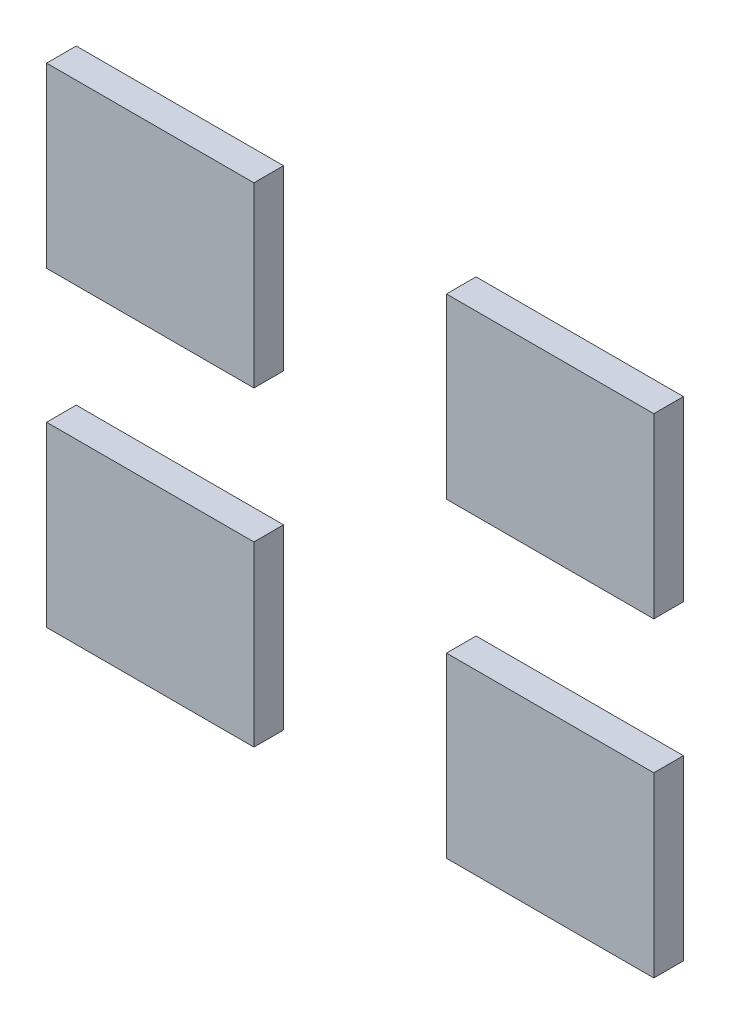
ISO-10303-21;
HEADER;
FILE_DESCRIPTION(('STEP AP214'),'2;1');
FILE_NAME('part.step','',(''),(''),'','','');
FILE_SCHEMA(('AUTOMOTIVE_DESIGN { 1 0 10303 214 1 1 1 1 }'));
ENDSEC;
DATA;
#1=APPLICATION_CONTEXT('core data for automotive mechanical design processes');
#2=APPLICATION_PROTOCOL_DEFINITION('international standard','automotive_design',2000,#1);
#3=PRODUCT_CONTEXT('',#1,'mechanical');
#4=PRODUCT('Part','Part','',(#3));
#5=PRODUCT_RELATED_PRODUCT_CATEGORY('part','',(#4));
#6=PRODUCT_DEFINITION_FORMATION('','',#4);
#7=PRODUCT_DEFINITION_CONTEXT('part definition',#1,'design');
#8=PRODUCT_DEFINITION('design','',#6,#7);
#9=PRODUCT_DEFINITION_SHAPE('','',#8);
#10=(LENGTH_UNIT() NAMED_UNIT(*) SI_UNIT(.MILLI.,.METRE.));
#11=(NAMED_UNIT(*) PLANE_ANGLE_UNIT() SI_UNIT($,.RADIAN.));
#12=(NAMED_UNIT(*) SI_UNIT($,.STERADIAN.) SOLID_ANGLE_UNIT());
#13=UNCERTAINTY_MEASURE_WITH_UNIT(LENGTH_MEASURE(1.E-05),#10,'distance_accuracy_value','');
#14=(GEOMETRIC_REPRESENTATION_CONTEXT(3) GLOBAL_UNCERTAINTY_ASSIGNED_CONTEXT((#13)) GLOBAL_UNIT_ASSIGNED_CONTEXT((#10,
#11,#12)) REPRESENTATION_CONTEXT('',''));
#15=CARTESIAN_POINT('',(0.,0.,0.));
#16=DIRECTION('',(0.,0.,1.));
#17=DIRECTION('',(1.,0.,0.));
#18=AXIS2_PLACEMENT_3D('',#15,#16,#17);
#19=CARTESIAN_POINT('',(0.325,0.225,0.1));
#20=DIRECTION('',(0.,0.,1.));
#21=DIRECTION('',(1.,0.,0.));
#22=AXIS2_PLACEMENT_3D('',#19,#20,#21);
#23=PLANE('',#22);
#24=DIRECTION('',(0.,1.,0.));
#25=VECTOR('',#24,1.);
#26=CARTESIAN_POINT('',(1.025,0.225,0.1));
#27=LINE('',#26,#25);
#28=CARTESIAN_POINT('',(1.025,0.825,0.1));
#29=VERTEX_POINT('',#28);
#30=CARTESIAN_POINT('',(1.025,0.225,0.1));
#31=VERTEX_POINT('',#30);
#32=EDGE_CURVE('P0_E76',#29,#31,#27,.F.);
#33=ORIENTED_EDGE('',*,*,#32,.F.);
#34=DIRECTION('',(1.,0.,0.));
#35=VECTOR('',#34,1.);
#36=CARTESIAN_POINT('',(0.325,0.825,0.1));
#37=LINE('',#36,#35);
#38=CARTESIAN_POINT('',(0.325,0.825,0.1));
#39=VERTEX_POINT('',#38);
#40=EDGE_CURVE('P0_E58',#39,#29,#37,.T.);
#41=ORIENTED_EDGE('',*,*,#40,.F.);
#42=DIRECTION('',(0.,1.,0.));
#43=VECTOR('',#42,1.);
#44=CARTESIAN_POINT('',(0.325,0.225,0.1));
#45=LINE('',#44,#43);
#46=CARTESIAN_POINT('',(0.325,0.225,0.1));
#47=VERTEX_POINT('',#46);
#48=EDGE_CURVE('P0_E20',#39,#47,#45,.F.);
#49=ORIENTED_EDGE('',*,*,#48,.T.);
#50=DIRECTION('',(1.,0.,0.));
#51=VECTOR('',#50,1.);
#52=CARTESIAN_POINT('',(0.325,0.225,0.1));
#53=LINE('',#52,#51);
#54=EDGE_CURVE('P0_E55',#47,#31,#53,.T.);
#55=ORIENTED_EDGE('',*,*,#54,.T.);
#56=EDGE_LOOP('',(#33,#41,#49,#55));
#57=FACE_BOUND('',#56,.T.);
#58=ADVANCED_FACE('P0_F17',(#57),#23,.T.);
#59=CARTESIAN_POINT('',(0.325,0.225,0.));
#60=DIRECTION('',(1.,0.,0.));
#61=DIRECTION('',(0.,0.,-1.));
#62=AXIS2_PLACEMENT_3D('',#59,#60,#61);
#63=PLANE('',#62);
#64=DIRECTION('',(0.,0.,1.));
#65=VECTOR('',#64,1.);
#66=CARTESIAN_POINT('',(0.325,0.825,0.));
#67=LINE('',#66,#65);
#68=CARTESIAN_POINT('',(0.325,0.825,0.));
#69=VERTEX_POINT('',#68);
#70=EDGE_CURVE('P0_E78',#69,#39,#67,.T.);
#71=ORIENTED_EDGE('',*,*,#70,.F.);
#72=DIRECTION('',(0.,1.,0.));
#73=VECTOR('',#72,1.);
#74=CARTESIAN_POINT('',(0.325,0.225,0.));
#75=LINE('',#74,#73);
#76=CARTESIAN_POINT('',(0.325,0.225,0.));
#77=VERTEX_POINT('',#76);
#78=EDGE_CURVE('P0_E73',#69,#77,#75,.F.);
#79=ORIENTED_EDGE('',*,*,#78,.T.);
#80=DIRECTION('',(0.,0.,1.));
#81=VECTOR('',#80,1.);
#82=CARTESIAN_POINT('',(0.325,0.225,0.));
#83=LINE('',#82,#81);
#84=EDGE_CURVE('P0_E63',#77,#47,#83,.T.);
#85=ORIENTED_EDGE('',*,*,#84,.T.);
#86=ORIENTED_EDGE('',*,*,#48,.F.);
#87=EDGE_LOOP('',(#71,#79,#85,#86));
#88=FACE_BOUND('',#87,.T.);
#89=ADVANCED_FACE('P0_F72',(#88),#63,.F.);
#90=CARTESIAN_POINT('',(0.325,0.225,0.));
#91=DIRECTION('',(0.,1.,0.));
#92=DIRECTION('',(0.,0.,1.));
#93=AXIS2_PLACEMENT_3D('',#90,#91,#92);
#94=PLANE('',#93);
#95=ORIENTED_EDGE('',*,*,#54,.F.);
#96=ORIENTED_EDGE('',*,*,#84,.F.);
#97=DIRECTION('',(1.,0.,0.));
#98=VECTOR('',#97,1.);
#99=CARTESIAN_POINT('',(0.325,0.225,0.));
#100=LINE('',#99,#98);
#101=CARTESIAN_POINT('',(1.025,0.225,0.));
#102=VERTEX_POINT('',#101);
#103=EDGE_CURVE('P0_E83',#77,#102,#100,.T.);
#104=ORIENTED_EDGE('',*,*,#103,.T.);
#105=DIRECTION('',(0.,0.,-1.));
#106=VECTOR('',#105,1.);
#107=CARTESIAN_POINT('',(1.025,0.225,0.));
#108=LINE('',#107,#106);
#109=EDGE_CURVE('P0_E69',#31,#102,#108,.T.);
#110=ORIENTED_EDGE('',*,*,#109,.F.);
#111=EDGE_LOOP('',(#95,#96,#104,#110));
#112=FACE_BOUND('',#111,.T.);
#113=ADVANCED_FACE('P0_F66',(#112),#94,.F.);
#114=CARTESIAN_POINT('',(1.025,0.225,0.));
#115=DIRECTION('',(1.,0.,0.));
#116=DIRECTION('',(0.,0.,-1.));
#117=AXIS2_PLACEMENT_3D('',#114,#115,#116);
#118=PLANE('',#117);
#119=DIRECTION('',(0.,0.,1.));
#120=VECTOR('',#119,1.);
#121=CARTESIAN_POINT('',(1.025,0.825,0.));
#122=LINE('',#121,#120);
#123=CARTESIAN_POINT('',(1.025,0.825,0.));
#124=VERTEX_POINT('',#123);
#125=EDGE_CURVE('P0_E34',#29,#124,#122,.F.);
#126=ORIENTED_EDGE('',*,*,#125,.F.);
#127=ORIENTED_EDGE('',*,*,#32,.T.);
#128=ORIENTED_EDGE('',*,*,#109,.T.);
#129=DIRECTION('',(0.,1.,0.));
#130=VECTOR('',#129,1.);
#131=CARTESIAN_POINT('',(1.025,0.225,0.));
#132=LINE('',#131,#130);
#133=EDGE_CURVE('P0_E26',#102,#124,#132,.T.);
#134=ORIENTED_EDGE('',*,*,#133,.T.);
#135=EDGE_LOOP('',(#126,#127,#128,#134));
#136=FACE_BOUND('',#135,.T.);
#137=ADVANCED_FACE('P0_F88',(#136),#118,.T.);
#138=CARTESIAN_POINT('',(0.325,0.825,0.));
#139=DIRECTION('',(0.,1.,0.));
#140=DIRECTION('',(0.,0.,1.));
#141=AXIS2_PLACEMENT_3D('',#138,#139,#140);
#142=PLANE('',#141);
#143=ORIENTED_EDGE('',*,*,#40,.T.);
#144=ORIENTED_EDGE('',*,*,#125,.T.);
#145=DIRECTION('',(1.,0.,0.));
#146=VECTOR('',#145,1.);
#147=CARTESIAN_POINT('',(0.325,0.825,0.));
#148=LINE('',#147,#146);
#149=EDGE_CURVE('P0_E11',#124,#69,#148,.F.);
#150=ORIENTED_EDGE('',*,*,#149,.T.);
#151=ORIENTED_EDGE('',*,*,#70,.T.);
#152=EDGE_LOOP('',(#143,#144,#150,#151));
#153=FACE_BOUND('',#152,.T.);
#154=ADVANCED_FACE('P0_F91',(#153),#142,.T.);
#155=CARTESIAN_POINT('',(0.325,0.225,0.));
#156=DIRECTION('',(0.,0.,1.));
#157=DIRECTION('',(1.,0.,0.));
#158=AXIS2_PLACEMENT_3D('',#155,#156,#157);
#159=PLANE('',#158);
#160=ORIENTED_EDGE('',*,*,#133,.F.);
#161=ORIENTED_EDGE('',*,*,#103,.F.);
#162=ORIENTED_EDGE('',*,*,#78,.F.);
#163=ORIENTED_EDGE('',*,*,#149,.F.);
#164=EDGE_LOOP('',(#160,#161,#162,#163));
#165=FACE_BOUND('',#164,.T.);
#166=ADVANCED_FACE('P0_F90',(#165),#159,.F.);
#167=CLOSED_SHELL('',(#58,#89,#113,#137,#154,#166));
#168=MANIFOLD_SOLID_BREP('P0_B1',#167);
#169=CARTESIAN_POINT('',(-1.025,0.225,0.1));
#170=DIRECTION('',(0.,0.,1.));
#171=DIRECTION('',(1.,0.,0.));
#172=AXIS2_PLACEMENT_3D('',#169,#170,#171);
#173=PLANE('',#172);
#174=DIRECTION('',(0.,1.,0.));
#175=VECTOR('',#174,1.);
#176=CARTESIAN_POINT('',(-0.325,0.225,0.1));
#177=LINE('',#176,#175);
#178=CARTESIAN_POINT('',(-0.325,0.825,0.1));
#179=VERTEX_POINT('',#178);
#180=CARTESIAN_POINT('',(-0.325,0.225,0.1));
#181=VERTEX_POINT('',#180);
#182=EDGE_CURVE('P1_E76',#179,#181,#177,.F.);
#183=ORIENTED_EDGE('',*,*,#182,.F.);
#184=DIRECTION('',(1.,0.,0.));
#185=VECTOR('',#184,1.);
#186=CARTESIAN_POINT('',(-1.025,0.825,0.1));
#187=LINE('',#186,#185);
#188=CARTESIAN_POINT('',(-1.025,0.825,0.1));
#189=VERTEX_POINT('',#188);
#190=EDGE_CURVE('P1_E58',#189,#179,#187,.T.);
#191=ORIENTED_EDGE('',*,*,#190,.F.);
#192=DIRECTION('',(0.,1.,0.));
#193=VECTOR('',#192,1.);
#194=CARTESIAN_POINT('',(-1.025,0.225,0.1));
#195=LINE('',#194,#193);
#196=CARTESIAN_POINT('',(-1.025,0.225,0.1));
#197=VERTEX_POINT('',#196);
#198=EDGE_CURVE('P1_E20',#189,#197,#195,.F.);
#199=ORIENTED_EDGE('',*,*,#198,.T.);
#200=DIRECTION('',(1.,0.,0.));
#201=VECTOR('',#200,1.);
#202=CARTESIAN_POINT('',(-1.025,0.225,0.1));
#203=LINE('',#202,#201);
#204=EDGE_CURVE('P1_E55',#197,#181,#203,.T.);
#205=ORIENTED_EDGE('',*,*,#204,.T.);
#206=EDGE_LOOP('',(#183,#191,#199,#205));
#207=FACE_BOUND('',#206,.T.);
#208=ADVANCED_FACE('P1_F17',(#207),#173,.T.);
#209=CARTESIAN_POINT('',(-1.025,0.225,0.));
#210=DIRECTION('',(1.,0.,0.));
#211=DIRECTION('',(0.,0.,-1.));
#212=AXIS2_PLACEMENT_3D('',#209,#210,#211);
#213=PLANE('',#212);
#214=DIRECTION('',(0.,0.,1.));
#215=VECTOR('',#214,1.);
#216=CARTESIAN_POINT('',(-1.025,0.825,0.));
#217=LINE('',#216,#215);
#218=CARTESIAN_POINT('',(-1.025,0.825,0.));
#219=VERTEX_POINT('',#218);
#220=EDGE_CURVE('P1_E78',#219,#189,#217,.T.);
#221=ORIENTED_EDGE('',*,*,#220,.F.);
#222=DIRECTION('',(0.,1.,0.));
#223=VECTOR('',#222,1.);
#224=CARTESIAN_POINT('',(-1.025,0.225,0.));
#225=LINE('',#224,#223);
#226=CARTESIAN_POINT('',(-1.025,0.225,0.));
#227=VERTEX_POINT('',#226);
#228=EDGE_CURVE('P1_E73',#219,#227,#225,.F.);
#229=ORIENTED_EDGE('',*,*,#228,.T.);
#230=DIRECTION('',(0.,0.,1.));
#231=VECTOR('',#230,1.);
#232=CARTESIAN_POINT('',(-1.025,0.225,0.));
#233=LINE('',#232,#231);
#234=EDGE_CURVE('P1_E63',#227,#197,#233,.T.);
#235=ORIENTED_EDGE('',*,*,#234,.T.);
#236=ORIENTED_EDGE('',*,*,#198,.F.);
#237=EDGE_LOOP('',(#221,#229,#235,#236));
#238=FACE_BOUND('',#237,.T.);
#239=ADVANCED_FACE('P1_F72',(#238),#213,.F.);
#240=CARTESIAN_POINT('',(-1.025,0.225,0.));
#241=DIRECTION('',(0.,1.,0.));
#242=DIRECTION('',(0.,0.,1.));
#243=AXIS2_PLACEMENT_3D('',#240,#241,#242);
#244=PLANE('',#243);
#245=ORIENTED_EDGE('',*,*,#204,.F.);
#246=ORIENTED_EDGE('',*,*,#234,.F.);
#247=DIRECTION('',(1.,0.,0.));
#248=VECTOR('',#247,1.);
#249=CARTESIAN_POINT('',(-1.025,0.225,0.));
#250=LINE('',#249,#248);
#251=CARTESIAN_POINT('',(-0.325,0.225,0.));
#252=VERTEX_POINT('',#251);
#253=EDGE_CURVE('P1_E83',#227,#252,#250,.T.);
#254=ORIENTED_EDGE('',*,*,#253,.T.);
#255=DIRECTION('',(0.,0.,-1.));
#256=VECTOR('',#255,1.);
#257=CARTESIAN_POINT('',(-0.325,0.225,0.));
#258=LINE('',#257,#256);
#259=EDGE_CURVE('P1_E69',#181,#252,#258,.T.);
#260=ORIENTED_EDGE('',*,*,#259,.F.);
#261=EDGE_LOOP('',(#245,#246,#254,#260));
#262=FACE_BOUND('',#261,.T.);
#263=ADVANCED_FACE('P1_F66',(#262),#244,.F.);
#264=CARTESIAN_POINT('',(-0.325,0.225,0.));
#265=DIRECTION('',(1.,0.,0.));
#266=DIRECTION('',(0.,0.,-1.));
#267=AXIS2_PLACEMENT_3D('',#264,#265,#266);
#268=PLANE('',#267);
#269=DIRECTION('',(0.,0.,1.));
#270=VECTOR('',#269,1.);
#271=CARTESIAN_POINT('',(-0.325,0.825,0.));
#272=LINE('',#271,#270);
#273=CARTESIAN_POINT('',(-0.325,0.825,0.));
#274=VERTEX_POINT('',#273);
#275=EDGE_CURVE('P1_E34',#179,#274,#272,.F.);
#276=ORIENTED_EDGE('',*,*,#275,.F.);
#277=ORIENTED_EDGE('',*,*,#182,.T.);
#278=ORIENTED_EDGE('',*,*,#259,.T.);
#279=DIRECTION('',(0.,1.,0.));
#280=VECTOR('',#279,1.);
#281=CARTESIAN_POINT('',(-0.325,0.225,0.));
#282=LINE('',#281,#280);
#283=EDGE_CURVE('P1_E26',#252,#274,#282,.T.);
#284=ORIENTED_EDGE('',*,*,#283,.T.);
#285=EDGE_LOOP('',(#276,#277,#278,#284));
#286=FACE_BOUND('',#285,.T.);
#287=ADVANCED_FACE('P1_F88',(#286),#268,.T.);
#288=CARTESIAN_POINT('',(-1.025,0.825,0.));
#289=DIRECTION('',(0.,1.,0.));
#290=DIRECTION('',(0.,0.,1.));
#291=AXIS2_PLACEMENT_3D('',#288,#289,#290);
#292=PLANE('',#291);
#293=ORIENTED_EDGE('',*,*,#190,.T.);
#294=ORIENTED_EDGE('',*,*,#275,.T.);
#295=DIRECTION('',(1.,0.,0.));
#296=VECTOR('',#295,1.);
#297=CARTESIAN_POINT('',(-1.025,0.825,0.));
#298=LINE('',#297,#296);
#299=EDGE_CURVE('P1_E11',#274,#219,#298,.F.);
#300=ORIENTED_EDGE('',*,*,#299,.T.);
#301=ORIENTED_EDGE('',*,*,#220,.T.);
#302=EDGE_LOOP('',(#293,#294,#300,#301));
#303=FACE_BOUND('',#302,.T.);
#304=ADVANCED_FACE('P1_F91',(#303),#292,.T.);
#305=CARTESIAN_POINT('',(-1.025,0.225,0.));
#306=DIRECTION('',(0.,0.,1.));
#307=DIRECTION('',(1.,0.,0.));
#308=AXIS2_PLACEMENT_3D('',#305,#306,#307);
#309=PLANE('',#308);
#310=ORIENTED_EDGE('',*,*,#283,.F.);
#311=ORIENTED_EDGE('',*,*,#253,.F.);
#312=ORIENTED_EDGE('',*,*,#228,.F.);
#313=ORIENTED_EDGE('',*,*,#299,.F.);
#314=EDGE_LOOP('',(#310,#311,#312,#313));
#315=FACE_BOUND('',#314,.T.);
#316=ADVANCED_FACE('P1_F90',(#315),#309,.F.);
#317=CLOSED_SHELL('',(#208,#239,#263,#287,#304,#316));
#318=MANIFOLD_SOLID_BREP('P1_B1',#317);
#319=CARTESIAN_POINT('',(0.325,-0.825,0.1));
#320=DIRECTION('',(0.,0.,1.));
#321=DIRECTION('',(1.,0.,0.));
#322=AXIS2_PLACEMENT_3D('',#319,#320,#321);
#323=PLANE('',#322);
#324=DIRECTION('',(0.,1.,0.));
#325=VECTOR('',#324,1.);
#326=CARTESIAN_POINT('',(1.025,-0.825,0.1));
#327=LINE('',#326,#325);
#328=CARTESIAN_POINT('',(1.025,-0.225,0.1));
#329=VERTEX_POINT('',#328);
#330=CARTESIAN_POINT('',(1.025,-0.825,0.1));
#331=VERTEX_POINT('',#330);
#332=EDGE_CURVE('P2_E76',#329,#331,#327,.F.);
#333=ORIENTED_EDGE('',*,*,#332,.F.);
#334=DIRECTION('',(1.,0.,0.));
#335=VECTOR('',#334,1.);
#336=CARTESIAN_POINT('',(0.325,-0.225,0.1));
#337=LINE('',#336,#335);
#338=CARTESIAN_POINT('',(0.325,-0.225,0.1));
#339=VERTEX_POINT('',#338);
#340=EDGE_CURVE('P2_E58',#339,#329,#337,.T.);
#341=ORIENTED_EDGE('',*,*,#340,.F.);
#342=DIRECTION('',(0.,1.,0.));
#343=VECTOR('',#342,1.);
#344=CARTESIAN_POINT('',(0.325,-0.825,0.1));
#345=LINE('',#344,#343);
#346=CARTESIAN_POINT('',(0.325,-0.825,0.1));
#347=VERTEX_POINT('',#346);
#348=EDGE_CURVE('P2_E20',#339,#347,#345,.F.);
#349=ORIENTED_EDGE('',*,*,#348,.T.);
#350=DIRECTION('',(1.,0.,0.));
#351=VECTOR('',#350,1.);
#352=CARTESIAN_POINT('',(0.325,-0.825,0.1));
#353=LINE('',#352,#351);
#354=EDGE_CURVE('P2_E55',#347,#331,#353,.T.);
#355=ORIENTED_EDGE('',*,*,#354,.T.);
#356=EDGE_LOOP('',(#333,#341,#349,#355));
#357=FACE_BOUND('',#356,.T.);
#358=ADVANCED_FACE('P2_F17',(#357),#323,.T.);
#359=CARTESIAN_POINT('',(0.325,-0.825,0.));
#360=DIRECTION('',(1.,0.,0.));
#361=DIRECTION('',(0.,0.,-1.));
#362=AXIS2_PLACEMENT_3D('',#359,#360,#361);
#363=PLANE('',#362);
#364=DIRECTION('',(0.,0.,1.));
#365=VECTOR('',#364,1.);
#366=CARTESIAN_POINT('',(0.325,-0.225,0.));
#367=LINE('',#366,#365);
#368=CARTESIAN_POINT('',(0.325,-0.225,0.));
#369=VERTEX_POINT('',#368);
#370=EDGE_CURVE('P2_E78',#369,#339,#367,.T.);
#371=ORIENTED_EDGE('',*,*,#370,.F.);
#372=DIRECTION('',(0.,1.,0.));
#373=VECTOR('',#372,1.);
#374=CARTESIAN_POINT('',(0.325,-0.825,0.));
#375=LINE('',#374,#373);
#376=CARTESIAN_POINT('',(0.325,-0.825,0.));
#377=VERTEX_POINT('',#376);
#378=EDGE_CURVE('P2_E73',#369,#377,#375,.F.);
#379=ORIENTED_EDGE('',*,*,#378,.T.);
#380=DIRECTION('',(0.,0.,1.));
#381=VECTOR('',#380,1.);
#382=CARTESIAN_POINT('',(0.325,-0.825,0.));
#383=LINE('',#382,#381);
#384=EDGE_CURVE('P2_E63',#377,#347,#383,.T.);
#385=ORIENTED_EDGE('',*,*,#384,.T.);
#386=ORIENTED_EDGE('',*,*,#348,.F.);
#387=EDGE_LOOP('',(#371,#379,#385,#386));
#388=FACE_BOUND('',#387,.T.);
#389=ADVANCED_FACE('P2_F72',(#388),#363,.F.);
#390=CARTESIAN_POINT('',(0.325,-0.825,0.));
#391=DIRECTION('',(0.,1.,0.));
#392=DIRECTION('',(0.,0.,1.));
#393=AXIS2_PLACEMENT_3D('',#390,#391,#392);
#394=PLANE('',#393);
#395=ORIENTED_EDGE('',*,*,#354,.F.);
#396=ORIENTED_EDGE('',*,*,#384,.F.);
#397=DIRECTION('',(1.,0.,0.));
#398=VECTOR('',#397,1.);
#399=CARTESIAN_POINT('',(0.325,-0.825,0.));
#400=LINE('',#399,#398);
#401=CARTESIAN_POINT('',(1.025,-0.825,0.));
#402=VERTEX_POINT('',#401);
#403=EDGE_CURVE('P2_E83',#377,#402,#400,.T.);
#404=ORIENTED_EDGE('',*,*,#403,.T.);
#405=DIRECTION('',(0.,0.,-1.));
#406=VECTOR('',#405,1.);
#407=CARTESIAN_POINT('',(1.025,-0.825,0.));
#408=LINE('',#407,#406);
#409=EDGE_CURVE('P2_E69',#331,#402,#408,.T.);
#410=ORIENTED_EDGE('',*,*,#409,.F.);
#411=EDGE_LOOP('',(#395,#396,#404,#410));
#412=FACE_BOUND('',#411,.T.);
#413=ADVANCED_FACE('P2_F66',(#412),#394,.F.);
#414=CARTESIAN_POINT('',(1.025,-0.825,0.));
#415=DIRECTION('',(1.,0.,0.));
#416=DIRECTION('',(0.,0.,-1.));
#417=AXIS2_PLACEMENT_3D('',#414,#415,#416);
#418=PLANE('',#417);
#419=DIRECTION('',(0.,0.,1.));
#420=VECTOR('',#419,1.);
#421=CARTESIAN_POINT('',(1.025,-0.225,0.));
#422=LINE('',#421,#420);
#423=CARTESIAN_POINT('',(1.025,-0.225,0.));
#424=VERTEX_POINT('',#423);
#425=EDGE_CURVE('P2_E34',#329,#424,#422,.F.);
#426=ORIENTED_EDGE('',*,*,#425,.F.);
#427=ORIENTED_EDGE('',*,*,#332,.T.);
#428=ORIENTED_EDGE('',*,*,#409,.T.);
#429=DIRECTION('',(0.,1.,0.));
#430=VECTOR('',#429,1.);
#431=CARTESIAN_POINT('',(1.025,-0.825,0.));
#432=LINE('',#431,#430);
#433=EDGE_CURVE('P2_E26',#402,#424,#432,.T.);
#434=ORIENTED_EDGE('',*,*,#433,.T.);
#435=EDGE_LOOP('',(#426,#427,#428,#434));
#436=FACE_BOUND('',#435,.T.);
#437=ADVANCED_FACE('P2_F88',(#436),#418,.T.);
#438=CARTESIAN_POINT('',(0.325,-0.225,0.));
#439=DIRECTION('',(0.,1.,0.));
#440=DIRECTION('',(0.,0.,1.));
#441=AXIS2_PLACEMENT_3D('',#438,#439,#440);
#442=PLANE('',#441);
#443=ORIENTED_EDGE('',*,*,#340,.T.);
#444=ORIENTED_EDGE('',*,*,#425,.T.);
#445=DIRECTION('',(1.,0.,0.));
#446=VECTOR('',#445,1.);
#447=CARTESIAN_POINT('',(0.325,-0.225,0.));
#448=LINE('',#447,#446);
#449=EDGE_CURVE('P2_E11',#424,#369,#448,.F.);
#450=ORIENTED_EDGE('',*,*,#449,.T.);
#451=ORIENTED_EDGE('',*,*,#370,.T.);
#452=EDGE_LOOP('',(#443,#444,#450,#451));
#453=FACE_BOUND('',#452,.T.);
#454=ADVANCED_FACE('P2_F91',(#453),#442,.T.);
#455=CARTESIAN_POINT('',(0.325,-0.825,0.));
#456=DIRECTION('',(0.,0.,1.));
#457=DIRECTION('',(1.,0.,0.));
#458=AXIS2_PLACEMENT_3D('',#455,#456,#457);
#459=PLANE('',#458);
#460=ORIENTED_EDGE('',*,*,#433,.F.);
#461=ORIENTED_EDGE('',*,*,#403,.F.);
#462=ORIENTED_EDGE('',*,*,#378,.F.);
#463=ORIENTED_EDGE('',*,*,#449,.F.);
#464=EDGE_LOOP('',(#460,#461,#462,#463));
#465=FACE_BOUND('',#464,.T.);
#466=ADVANCED_FACE('P2_F90',(#465),#459,.F.);
#467=CLOSED_SHELL('',(#358,#389,#413,#437,#454,#466));
#468=MANIFOLD_SOLID_BREP('P2_B1',#467);
#469=CARTESIAN_POINT('',(-1.025,-0.825,0.1));
#470=DIRECTION('',(0.,0.,1.));
#471=DIRECTION('',(1.,0.,0.));
#472=AXIS2_PLACEMENT_3D('',#469,#470,#471);
#473=PLANE('',#472);
#474=DIRECTION('',(0.,1.,0.));
#475=VECTOR('',#474,1.);
#476=CARTESIAN_POINT('',(-0.325,-0.825,0.1));
#477=LINE('',#476,#475);
#478=CARTESIAN_POINT('',(-0.325,-0.225,0.1));
#479=VERTEX_POINT('',#478);
#480=CARTESIAN_POINT('',(-0.325,-0.825,0.1));
#481=VERTEX_POINT('',#480);
#482=EDGE_CURVE('P3_E76',#479,#481,#477,.F.);
#483=ORIENTED_EDGE('',*,*,#482,.F.);
#484=DIRECTION('',(1.,0.,0.));
#485=VECTOR('',#484,1.);
#486=CARTESIAN_POINT('',(-1.025,-0.225,0.1));
#487=LINE('',#486,#485);
#488=CARTESIAN_POINT('',(-1.025,-0.225,0.1));
#489=VERTEX_POINT('',#488);
#490=EDGE_CURVE('P3_E58',#489,#479,#487,.T.);
#491=ORIENTED_EDGE('',*,*,#490,.F.);
#492=DIRECTION('',(0.,1.,0.));
#493=VECTOR('',#492,1.);
#494=CARTESIAN_POINT('',(-1.025,-0.825,0.1));
#495=LINE('',#494,#493);
#496=CARTESIAN_POINT('',(-1.025,-0.825,0.1));
#497=VERTEX_POINT('',#496);
#498=EDGE_CURVE('P3_E20',#489,#497,#495,.F.);
#499=ORIENTED_EDGE('',*,*,#498,.T.);
#500=DIRECTION('',(1.,0.,0.));
#501=VECTOR('',#500,1.);
#502=CARTESIAN_POINT('',(-1.025,-0.825,0.1));
#503=LINE('',#502,#501);
#504=EDGE_CURVE('P3_E55',#497,#481,#503,.T.);
#505=ORIENTED_EDGE('',*,*,#504,.T.);
#506=EDGE_LOOP('',(#483,#491,#499,#505));
#507=FACE_BOUND('',#506,.T.);
#508=ADVANCED_FACE('P3_F17',(#507),#473,.T.);
#509=CARTESIAN_POINT('',(-1.025,-0.825,0.));
#510=DIRECTION('',(1.,0.,0.));
#511=DIRECTION('',(0.,0.,-1.));
#512=AXIS2_PLACEMENT_3D('',#509,#510,#511);
#513=PLANE('',#512);
#514=DIRECTION('',(0.,0.,1.));
#515=VECTOR('',#514,1.);
#516=CARTESIAN_POINT('',(-1.025,-0.225,0.));
#517=LINE('',#516,#515);
#518=CARTESIAN_POINT('',(-1.025,-0.225,0.));
#519=VERTEX_POINT('',#518);
#520=EDGE_CURVE('P3_E78',#519,#489,#517,.T.);
#521=ORIENTED_EDGE('',*,*,#520,.F.);
#522=DIRECTION('',(0.,1.,0.));
#523=VECTOR('',#522,1.);
#524=CARTESIAN_POINT('',(-1.025,-0.825,0.));
#525=LINE('',#524,#523);
#526=CARTESIAN_POINT('',(-1.025,-0.825,0.));
#527=VERTEX_POINT('',#526);
#528=EDGE_CURVE('P3_E73',#519,#527,#525,.F.);
#529=ORIENTED_EDGE('',*,*,#528,.T.);
#530=DIRECTION('',(0.,0.,1.));
#531=VECTOR('',#530,1.);
#532=CARTESIAN_POINT('',(-1.025,-0.825,0.));
#533=LINE('',#532,#531);
#534=EDGE_CURVE('P3_E63',#527,#497,#533,.T.);
#535=ORIENTED_EDGE('',*,*,#534,.T.);
#536=ORIENTED_EDGE('',*,*,#498,.F.);
#537=EDGE_LOOP('',(#521,#529,#535,#536));
#538=FACE_BOUND('',#537,.T.);
#539=ADVANCED_FACE('P3_F72',(#538),#513,.F.);
#540=CARTESIAN_POINT('',(-1.025,-0.825,0.));
#541=DIRECTION('',(0.,1.,0.));
#542=DIRECTION('',(0.,0.,1.));
#543=AXIS2_PLACEMENT_3D('',#540,#541,#542);
#544=PLANE('',#543);
#545=ORIENTED_EDGE('',*,*,#504,.F.);
#546=ORIENTED_EDGE('',*,*,#534,.F.);
#547=DIRECTION('',(1.,0.,0.));
#548=VECTOR('',#547,1.);
#549=CARTESIAN_POINT('',(-1.025,-0.825,0.));
#550=LINE('',#549,#548);
#551=CARTESIAN_POINT('',(-0.325,-0.825,0.));
#552=VERTEX_POINT('',#551);
#553=EDGE_CURVE('P3_E83',#527,#552,#550,.T.);
#554=ORIENTED_EDGE('',*,*,#553,.T.);
#555=DIRECTION('',(0.,0.,-1.));
#556=VECTOR('',#555,1.);
#557=CARTESIAN_POINT('',(-0.325,-0.825,0.));
#558=LINE('',#557,#556);
#559=EDGE_CURVE('P3_E69',#481,#552,#558,.T.);
#560=ORIENTED_EDGE('',*,*,#559,.F.);
#561=EDGE_LOOP('',(#545,#546,#554,#560));
#562=FACE_BOUND('',#561,.T.);
#563=ADVANCED_FACE('P3_F66',(#562),#544,.F.);
#564=CARTESIAN_POINT('',(-0.325,-0.825,0.));
#565=DIRECTION('',(1.,0.,0.));
#566=DIRECTION('',(0.,0.,-1.));
#567=AXIS2_PLACEMENT_3D('',#564,#565,#566);
#568=PLANE('',#567);
#569=DIRECTION('',(0.,0.,1.));
#570=VECTOR('',#569,1.);
#571=CARTESIAN_POINT('',(-0.325,-0.225,0.));
#572=LINE('',#571,#570);
#573=CARTESIAN_POINT('',(-0.325,-0.225,0.));
#574=VERTEX_POINT('',#573);
#575=EDGE_CURVE('P3_E34',#479,#574,#572,.F.);
#576=ORIENTED_EDGE('',*,*,#575,.F.);
#577=ORIENTED_EDGE('',*,*,#482,.T.);
#578=ORIENTED_EDGE('',*,*,#559,.T.);
#579=DIRECTION('',(0.,1.,0.));
#580=VECTOR('',#579,1.);
#581=CARTESIAN_POINT('',(-0.325,-0.825,0.));
#582=LINE('',#581,#580);
#583=EDGE_CURVE('P3_E26',#552,#574,#582,.T.);
#584=ORIENTED_EDGE('',*,*,#583,.T.);
#585=EDGE_LOOP('',(#576,#577,#578,#584));
#586=FACE_BOUND('',#585,.T.);
#587=ADVANCED_FACE('P3_F88',(#586),#568,.T.);
#588=CARTESIAN_POINT('',(-1.025,-0.225,0.));
#589=DIRECTION('',(0.,1.,0.));
#590=DIRECTION('',(0.,0.,1.));
#591=AXIS2_PLACEMENT_3D('',#588,#589,#590);
#592=PLANE('',#591);
#593=ORIENTED_EDGE('',*,*,#490,.T.);
#594=ORIENTED_EDGE('',*,*,#575,.T.);
#595=DIRECTION('',(1.,0.,0.));
#596=VECTOR('',#595,1.);
#597=CARTESIAN_POINT('',(-1.025,-0.225,0.));
#598=LINE('',#597,#596);
#599=EDGE_CURVE('P3_E11',#574,#519,#598,.F.);
#600=ORIENTED_EDGE('',*,*,#599,.T.);
#601=ORIENTED_EDGE('',*,*,#520,.T.);
#602=EDGE_LOOP('',(#593,#594,#600,#601));
#603=FACE_BOUND('',#602,.T.);
#604=ADVANCED_FACE('P3_F91',(#603),#592,.T.);
#605=CARTESIAN_POINT('',(-1.025,-0.825,0.));
#606=DIRECTION('',(0.,0.,1.));
#607=DIRECTION('',(1.,0.,0.));
#608=AXIS2_PLACEMENT_3D('',#605,#606,#607);
#609=PLANE('',#608);
#610=ORIENTED_EDGE('',*,*,#583,.F.);
#611=ORIENTED_EDGE('',*,*,#553,.F.);
#612=ORIENTED_EDGE('',*,*,#528,.F.);
#613=ORIENTED_EDGE('',*,*,#599,.F.);
#614=EDGE_LOOP('',(#610,#611,#612,#613));
#615=FACE_BOUND('',#614,.T.);
#616=ADVANCED_FACE('P3_F90',(#615),#609,.F.);
#617=CLOSED_SHELL('',(#508,#539,#563,#587,#604,#616));
#618=MANIFOLD_SOLID_BREP('P3_B1',#617);
#619=ADVANCED_BREP_SHAPE_REPRESENTATION('',(#18,#168,#318,#468,#618),#14);
#620=SHAPE_DEFINITION_REPRESENTATION(#9,#619);
ENDSEC;
END-ISO-10303-21;
